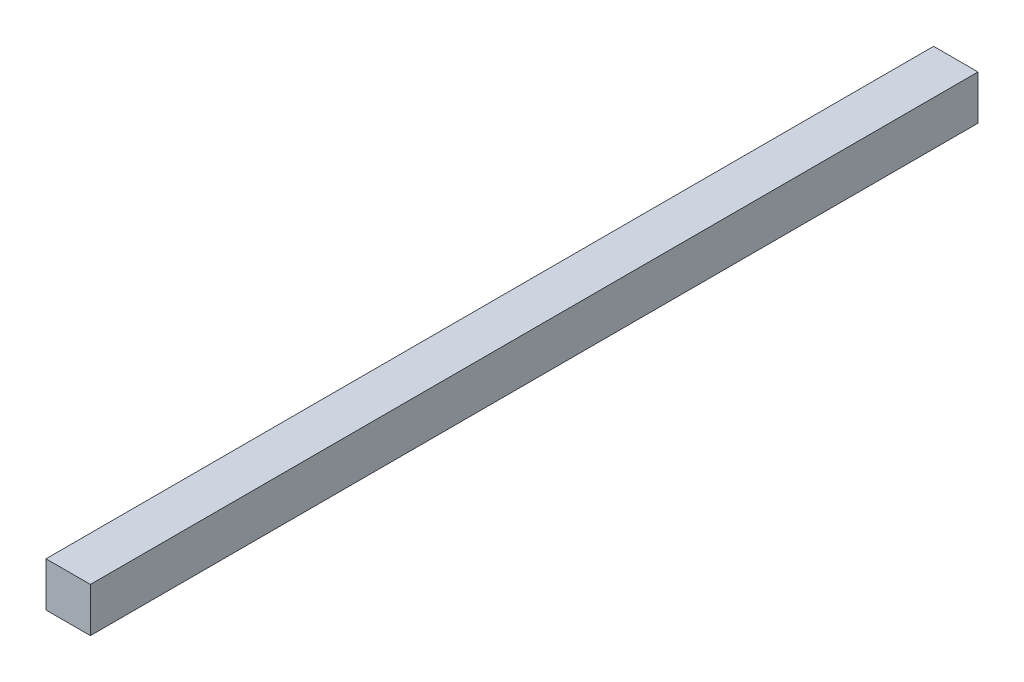
ISO-10303-21;
HEADER;
FILE_DESCRIPTION(('STEP AP214'),'2;1');
FILE_NAME('part.step','',(''),(''),'','','');
FILE_SCHEMA(('AUTOMOTIVE_DESIGN { 1 0 10303 214 1 1 1 1 }'));
ENDSEC;
DATA;
#1=APPLICATION_CONTEXT('core data for automotive mechanical design processes');
#2=APPLICATION_PROTOCOL_DEFINITION('international standard','automotive_design',2000,#1);
#3=PRODUCT_CONTEXT('',#1,'mechanical');
#4=PRODUCT('Part','Part','',(#3));
#5=PRODUCT_RELATED_PRODUCT_CATEGORY('part','',(#4));
#6=PRODUCT_DEFINITION_FORMATION('','',#4);
#7=PRODUCT_DEFINITION_CONTEXT('part definition',#1,'design');
#8=PRODUCT_DEFINITION('design','',#6,#7);
#9=PRODUCT_DEFINITION_SHAPE('','',#8);
#10=(LENGTH_UNIT() NAMED_UNIT(*) SI_UNIT(.MILLI.,.METRE.));
#11=(NAMED_UNIT(*) PLANE_ANGLE_UNIT() SI_UNIT($,.RADIAN.));
#12=(NAMED_UNIT(*) SI_UNIT($,.STERADIAN.) SOLID_ANGLE_UNIT());
#13=UNCERTAINTY_MEASURE_WITH_UNIT(LENGTH_MEASURE(1.E-05),#10,'distance_accuracy_value','');
#14=(GEOMETRIC_REPRESENTATION_CONTEXT(3) GLOBAL_UNCERTAINTY_ASSIGNED_CONTEXT((#13)) GLOBAL_UNIT_ASSIGNED_CONTEXT((#10,
#11,#12)) REPRESENTATION_CONTEXT('',''));
#15=CARTESIAN_POINT('',(0.,0.,0.));
#16=DIRECTION('',(0.,0.,1.));
#17=DIRECTION('',(1.,0.,0.));
#18=AXIS2_PLACEMENT_3D('',#15,#16,#17);
#19=CARTESIAN_POINT('',(-5.,5.,300.));
#20=DIRECTION('',(1.,0.,0.));
#21=DIRECTION('',(0.,1.,0.));
#22=AXIS2_PLACEMENT_3D('',#19,#20,#21);
#23=PLANE('',#22);
#24=DIRECTION('',(0.,1.,0.));
#25=VECTOR('',#24,1.);
#26=CARTESIAN_POINT('',(-5.,-5.,100.));
#27=LINE('',#26,#25);
#28=CARTESIAN_POINT('',(-5.,-5.,100.));
#29=VERTEX_POINT('',#28);
#30=CARTESIAN_POINT('',(-5.,5.,100.));
#31=VERTEX_POINT('',#30);
#32=EDGE_CURVE('E46',#29,#31,#27,.T.);
#33=ORIENTED_EDGE('',*,*,#32,.F.);
#34=DIRECTION('',(0.,0.,-1.));
#35=VECTOR('',#34,1.);
#36=CARTESIAN_POINT('',(-5.,-5.,300.));
#37=LINE('',#36,#35);
#38=CARTESIAN_POINT('',(-5.,-5.,300.));
#39=VERTEX_POINT('',#38);
#40=EDGE_CURVE('E11',#39,#29,#37,.T.);
#41=ORIENTED_EDGE('',*,*,#40,.F.);
#42=DIRECTION('',(0.,-1.,0.));
#43=VECTOR('',#42,1.);
#44=CARTESIAN_POINT('',(-5.,5.,300.));
#45=LINE('',#44,#43);
#46=CARTESIAN_POINT('',(-5.,5.,300.));
#47=VERTEX_POINT('',#46);
#48=EDGE_CURVE('E90',#47,#39,#45,.T.);
#49=ORIENTED_EDGE('',*,*,#48,.F.);
#50=DIRECTION('',(0.,0.,-1.));
#51=VECTOR('',#50,1.);
#52=CARTESIAN_POINT('',(-5.,5.,300.));
#53=LINE('',#52,#51);
#54=EDGE_CURVE('E53',#47,#31,#53,.T.);
#55=ORIENTED_EDGE('',*,*,#54,.T.);
#56=EDGE_LOOP('',(#33,#41,#49,#55));
#57=FACE_BOUND('',#56,.T.);
#58=ADVANCED_FACE('F32',(#57),#23,.F.);
#59=CARTESIAN_POINT('',(-5.,-5.,300.));
#60=DIRECTION('',(0.,1.,0.));
#61=DIRECTION('',(0.,0.,1.));
#62=AXIS2_PLACEMENT_3D('',#59,#60,#61);
#63=PLANE('',#62);
#64=DIRECTION('',(-1.,0.,0.));
#65=VECTOR('',#64,1.);
#66=CARTESIAN_POINT('',(5.,-5.,100.));
#67=LINE('',#66,#65);
#68=CARTESIAN_POINT('',(5.,-5.,100.));
#69=VERTEX_POINT('',#68);
#70=EDGE_CURVE('E71',#69,#29,#67,.T.);
#71=ORIENTED_EDGE('',*,*,#70,.F.);
#72=DIRECTION('',(0.,0.,-1.));
#73=VECTOR('',#72,1.);
#74=CARTESIAN_POINT('',(5.,-5.,300.));
#75=LINE('',#74,#73);
#76=CARTESIAN_POINT('',(5.,-5.,300.));
#77=VERTEX_POINT('',#76);
#78=EDGE_CURVE('E39',#77,#69,#75,.T.);
#79=ORIENTED_EDGE('',*,*,#78,.F.);
#80=DIRECTION('',(1.,0.,0.));
#81=VECTOR('',#80,1.);
#82=CARTESIAN_POINT('',(-5.,-5.,300.));
#83=LINE('',#82,#81);
#84=EDGE_CURVE('E84',#39,#77,#83,.T.);
#85=ORIENTED_EDGE('',*,*,#84,.F.);
#86=ORIENTED_EDGE('',*,*,#40,.T.);
#87=EDGE_LOOP('',(#71,#79,#85,#86));
#88=FACE_BOUND('',#87,.T.);
#89=ADVANCED_FACE('F83',(#88),#63,.F.);
#90=CARTESIAN_POINT('',(5.,5.,300.));
#91=DIRECTION('',(1.,0.,0.));
#92=DIRECTION('',(0.,1.,0.));
#93=AXIS2_PLACEMENT_3D('',#90,#91,#92);
#94=PLANE('',#93);
#95=ORIENTED_EDGE('',*,*,#78,.T.);
#96=DIRECTION('',(0.,-1.,0.));
#97=VECTOR('',#96,1.);
#98=CARTESIAN_POINT('',(5.,5.,100.));
#99=LINE('',#98,#97);
#100=CARTESIAN_POINT('',(5.,5.,100.));
#101=VERTEX_POINT('',#100);
#102=EDGE_CURVE('E74',#101,#69,#99,.T.);
#103=ORIENTED_EDGE('',*,*,#102,.F.);
#104=DIRECTION('',(0.,0.,-1.));
#105=VECTOR('',#104,1.);
#106=CARTESIAN_POINT('',(5.,5.,300.));
#107=LINE('',#106,#105);
#108=CARTESIAN_POINT('',(5.,5.,300.));
#109=VERTEX_POINT('',#108);
#110=EDGE_CURVE('E102',#109,#101,#107,.T.);
#111=ORIENTED_EDGE('',*,*,#110,.F.);
#112=DIRECTION('',(0.,-1.,0.));
#113=VECTOR('',#112,1.);
#114=CARTESIAN_POINT('',(5.,5.,300.));
#115=LINE('',#114,#113);
#116=EDGE_CURVE('E89',#109,#77,#115,.T.);
#117=ORIENTED_EDGE('',*,*,#116,.T.);
#118=EDGE_LOOP('',(#95,#103,#111,#117));
#119=FACE_BOUND('',#118,.T.);
#120=ADVANCED_FACE('F105',(#119),#94,.T.);
#121=CARTESIAN_POINT('',(-5.,5.,300.));
#122=DIRECTION('',(0.,1.,0.));
#123=DIRECTION('',(0.,0.,1.));
#124=AXIS2_PLACEMENT_3D('',#121,#122,#123);
#125=PLANE('',#124);
#126=ORIENTED_EDGE('',*,*,#110,.T.);
#127=DIRECTION('',(1.,0.,0.));
#128=VECTOR('',#127,1.);
#129=CARTESIAN_POINT('',(-5.,5.,100.));
#130=LINE('',#129,#128);
#131=EDGE_CURVE('E81',#31,#101,#130,.T.);
#132=ORIENTED_EDGE('',*,*,#131,.F.);
#133=ORIENTED_EDGE('',*,*,#54,.F.);
#134=DIRECTION('',(1.,0.,0.));
#135=VECTOR('',#134,1.);
#136=CARTESIAN_POINT('',(-5.,5.,300.));
#137=LINE('',#136,#135);
#138=EDGE_CURVE('E94',#47,#109,#137,.T.);
#139=ORIENTED_EDGE('',*,*,#138,.T.);
#140=EDGE_LOOP('',(#126,#132,#133,#139));
#141=FACE_BOUND('',#140,.T.);
#142=ADVANCED_FACE('F106',(#141),#125,.T.);
#143=CARTESIAN_POINT('',(0.,0.,300.));
#144=DIRECTION('',(0.,0.,1.));
#145=DIRECTION('',(1.,0.,0.));
#146=AXIS2_PLACEMENT_3D('',#143,#144,#145);
#147=PLANE('',#146);
#148=ORIENTED_EDGE('',*,*,#48,.T.);
#149=ORIENTED_EDGE('',*,*,#84,.T.);
#150=ORIENTED_EDGE('',*,*,#116,.F.);
#151=ORIENTED_EDGE('',*,*,#138,.F.);
#152=EDGE_LOOP('',(#148,#149,#150,#151));
#153=FACE_BOUND('',#152,.T.);
#154=ADVANCED_FACE('F93',(#153),#147,.T.);
#155=CARTESIAN_POINT('',(0.,0.,100.));
#156=DIRECTION('',(0.,0.,-1.));
#157=DIRECTION('',(-1.,0.,0.));
#158=AXIS2_PLACEMENT_3D('',#155,#156,#157);
#159=PLANE('',#158);
#160=ORIENTED_EDGE('',*,*,#70,.T.);
#161=ORIENTED_EDGE('',*,*,#32,.T.);
#162=ORIENTED_EDGE('',*,*,#131,.T.);
#163=ORIENTED_EDGE('',*,*,#102,.T.);
#164=EDGE_LOOP('',(#160,#161,#162,#163));
#165=FACE_BOUND('',#164,.T.);
#166=ADVANCED_FACE('F72',(#165),#159,.T.);
#167=CLOSED_SHELL('',(#58,#89,#120,#142,#154,#166));
#168=MANIFOLD_SOLID_BREP('B2',#167);
#169=ADVANCED_BREP_SHAPE_REPRESENTATION('',(#18,#168),#14);
#170=SHAPE_DEFINITION_REPRESENTATION(#9,#169);
ENDSEC;
END-ISO-10303-21;
